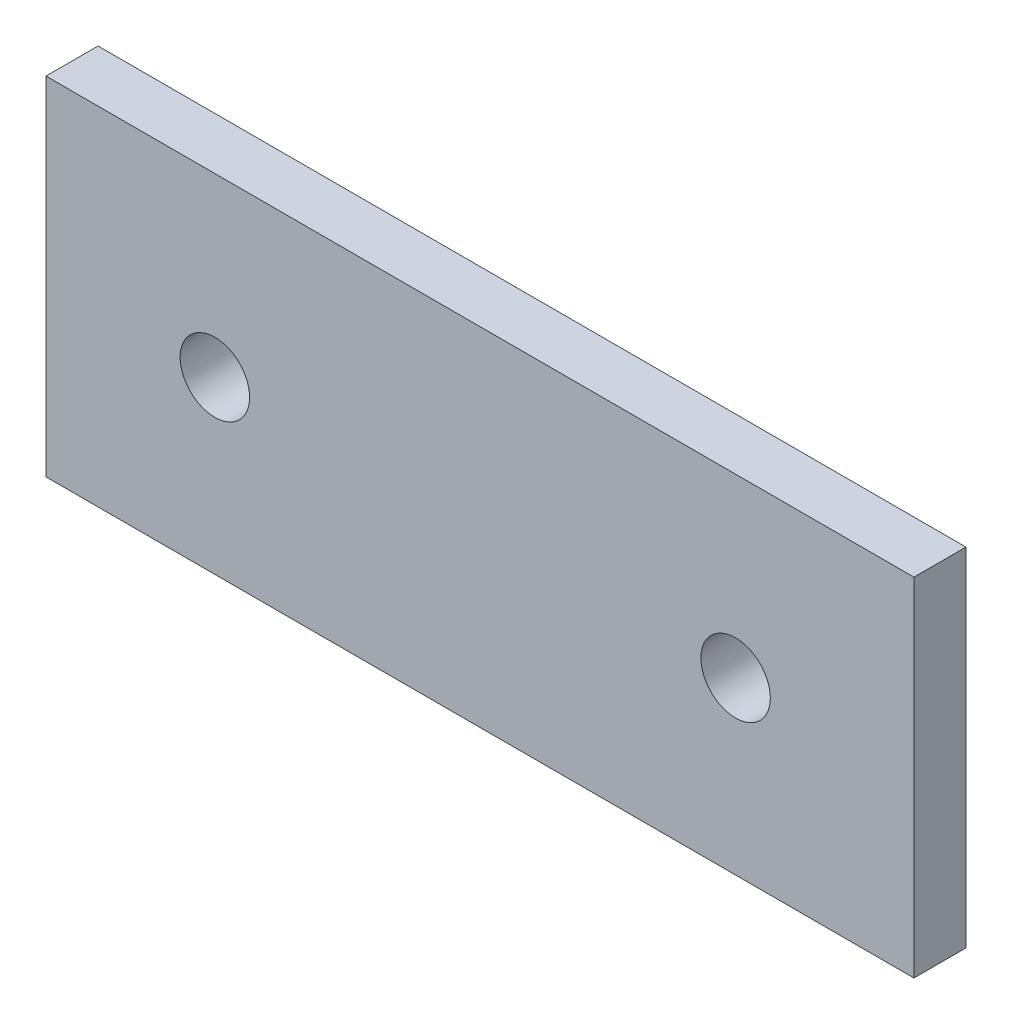
ISO-10303-21;
HEADER;
FILE_DESCRIPTION(('STEP AP214'),'2;1');
FILE_NAME('part.step','',(''),(''),'','','');
FILE_SCHEMA(('AUTOMOTIVE_DESIGN { 1 0 10303 214 1 1 1 1 }'));
ENDSEC;
DATA;
#1=APPLICATION_CONTEXT('core data for automotive mechanical design processes');
#2=APPLICATION_PROTOCOL_DEFINITION('international standard','automotive_design',2000,#1);
#3=PRODUCT_CONTEXT('',#1,'mechanical');
#4=PRODUCT('Part','Part','',(#3));
#5=PRODUCT_RELATED_PRODUCT_CATEGORY('part','',(#4));
#6=PRODUCT_DEFINITION_FORMATION('','',#4);
#7=PRODUCT_DEFINITION_CONTEXT('part definition',#1,'design');
#8=PRODUCT_DEFINITION('design','',#6,#7);
#9=PRODUCT_DEFINITION_SHAPE('','',#8);
#10=(LENGTH_UNIT() NAMED_UNIT(*) SI_UNIT(.MILLI.,.METRE.));
#11=(NAMED_UNIT(*) PLANE_ANGLE_UNIT() SI_UNIT($,.RADIAN.));
#12=(NAMED_UNIT(*) SI_UNIT($,.STERADIAN.) SOLID_ANGLE_UNIT());
#13=UNCERTAINTY_MEASURE_WITH_UNIT(LENGTH_MEASURE(1.E-05),#10,'distance_accuracy_value','');
#14=(GEOMETRIC_REPRESENTATION_CONTEXT(3) GLOBAL_UNCERTAINTY_ASSIGNED_CONTEXT((#13)) GLOBAL_UNIT_ASSIGNED_CONTEXT((#10,
#11,#12)) REPRESENTATION_CONTEXT('',''));
#15=CARTESIAN_POINT('',(0.,0.,0.));
#16=DIRECTION('',(0.,0.,1.));
#17=DIRECTION('',(1.,0.,0.));
#18=AXIS2_PLACEMENT_3D('',#15,#16,#17);
#19=CARTESIAN_POINT('',(0.,0.,3.));
#20=DIRECTION('',(0.,0.,1.));
#21=DIRECTION('',(1.,0.,0.));
#22=AXIS2_PLACEMENT_3D('',#19,#20,#21);
#23=PLANE('',#22);
#24=CARTESIAN_POINT('',(-67.7615716692326,0.,3.));
#25=DIRECTION('',(0.,0.,1.));
#26=DIRECTION('',(1.,0.,0.));
#27=AXIS2_PLACEMENT_3D('',#24,#25,#26);
#28=CIRCLE('',#27,2.);
#29=CARTESIAN_POINT('',(-65.7615716692326,0.,3.));
#30=VERTEX_POINT('',#29);
#31=EDGE_CURVE('E129',#30,#30,#28,.T.);
#32=ORIENTED_EDGE('',*,*,#31,.F.);
#33=EDGE_LOOP('',(#32));
#34=FACE_BOUND('',#33,.T.);
#35=DIRECTION('',(0.,-1.,0.));
#36=VECTOR('',#35,1.);
#37=CARTESIAN_POINT('',(-77.4890829508854,10.1651390959698,3.));
#38=LINE('',#37,#36);
#39=CARTESIAN_POINT('',(-77.4890829508854,10.1651390959698,3.));
#40=VERTEX_POINT('',#39);
#41=CARTESIAN_POINT('',(-77.4890829508854,-9.83486090403022,3.));
#42=VERTEX_POINT('',#41);
#43=EDGE_CURVE('E113',#40,#42,#38,.T.);
#44=ORIENTED_EDGE('',*,*,#43,.T.);
#45=DIRECTION('',(1.,0.,0.));
#46=VECTOR('',#45,1.);
#47=CARTESIAN_POINT('',(-77.4890829508854,-9.83486090403022,3.));
#48=LINE('',#47,#46);
#49=CARTESIAN_POINT('',(-27.4890829508854,-9.83486090403022,3.));
#50=VERTEX_POINT('',#49);
#51=EDGE_CURVE('E105',#42,#50,#48,.T.);
#52=ORIENTED_EDGE('',*,*,#51,.T.);
#53=DIRECTION('',(0.,-1.,0.));
#54=VECTOR('',#53,1.);
#55=CARTESIAN_POINT('',(-27.4890829508854,10.1651390959698,3.));
#56=LINE('',#55,#54);
#57=CARTESIAN_POINT('',(-27.4890829508854,10.1651390959698,3.));
#58=VERTEX_POINT('',#57);
#59=EDGE_CURVE('E112',#58,#50,#56,.T.);
#60=ORIENTED_EDGE('',*,*,#59,.F.);
#61=DIRECTION('',(1.,0.,0.));
#62=VECTOR('',#61,1.);
#63=CARTESIAN_POINT('',(-77.4890829508854,10.1651390959698,3.));
#64=LINE('',#63,#62);
#65=EDGE_CURVE('E122',#40,#58,#64,.T.);
#66=ORIENTED_EDGE('',*,*,#65,.F.);
#67=EDGE_LOOP('',(#44,#52,#60,#66));
#68=FACE_BOUND('',#67,.T.);
#69=CARTESIAN_POINT('',(-37.7615716692326,0.,3.));
#70=DIRECTION('',(0.,0.,1.));
#71=DIRECTION('',(1.,0.,0.));
#72=AXIS2_PLACEMENT_3D('',#69,#70,#71);
#73=CIRCLE('',#72,2.);
#74=CARTESIAN_POINT('',(-35.7615716692326,0.,3.));
#75=VERTEX_POINT('',#74);
#76=EDGE_CURVE('E142',#75,#75,#73,.T.);
#77=ORIENTED_EDGE('',*,*,#76,.F.);
#78=EDGE_LOOP('',(#77));
#79=FACE_BOUND('',#78,.T.);
#80=ADVANCED_FACE('F63',(#34,#68,#79),#23,.T.);
#81=CARTESIAN_POINT('',(0.,0.,0.));
#82=DIRECTION('',(0.,0.,1.));
#83=DIRECTION('',(1.,0.,0.));
#84=AXIS2_PLACEMENT_3D('',#81,#82,#83);
#85=PLANE('',#84);
#86=CARTESIAN_POINT('',(-67.7615716692326,0.,0.));
#87=DIRECTION('',(0.,0.,1.));
#88=DIRECTION('',(1.,0.,0.));
#89=AXIS2_PLACEMENT_3D('',#86,#87,#88);
#90=CIRCLE('',#89,2.);
#91=CARTESIAN_POINT('',(-65.7615716692326,0.,0.));
#92=VERTEX_POINT('',#91);
#93=EDGE_CURVE('E139',#92,#92,#90,.T.);
#94=ORIENTED_EDGE('',*,*,#93,.T.);
#95=EDGE_LOOP('',(#94));
#96=FACE_BOUND('',#95,.T.);
#97=DIRECTION('',(0.,-1.,0.));
#98=VECTOR('',#97,1.);
#99=CARTESIAN_POINT('',(-77.4890829508854,10.1651390959698,0.));
#100=LINE('',#99,#98);
#101=CARTESIAN_POINT('',(-77.4890829508854,10.1651390959698,0.));
#102=VERTEX_POINT('',#101);
#103=CARTESIAN_POINT('',(-77.4890829508854,-9.83486090403022,0.));
#104=VERTEX_POINT('',#103);
#105=EDGE_CURVE('E127',#102,#104,#100,.T.);
#106=ORIENTED_EDGE('',*,*,#105,.F.);
#107=DIRECTION('',(1.,0.,0.));
#108=VECTOR('',#107,1.);
#109=CARTESIAN_POINT('',(-77.4890829508854,10.1651390959698,0.));
#110=LINE('',#109,#108);
#111=CARTESIAN_POINT('',(-27.4890829508854,10.1651390959698,0.));
#112=VERTEX_POINT('',#111);
#113=EDGE_CURVE('E133',#102,#112,#110,.T.);
#114=ORIENTED_EDGE('',*,*,#113,.T.);
#115=DIRECTION('',(0.,-1.,0.));
#116=VECTOR('',#115,1.);
#117=CARTESIAN_POINT('',(-27.4890829508854,10.1651390959698,0.));
#118=LINE('',#117,#116);
#119=CARTESIAN_POINT('',(-27.4890829508854,-9.83486090403022,0.));
#120=VERTEX_POINT('',#119);
#121=EDGE_CURVE('E131',#112,#120,#118,.T.);
#122=ORIENTED_EDGE('',*,*,#121,.T.);
#123=DIRECTION('',(1.,0.,0.));
#124=VECTOR('',#123,1.);
#125=CARTESIAN_POINT('',(-77.4890829508854,-9.83486090403022,0.));
#126=LINE('',#125,#124);
#127=EDGE_CURVE('E118',#104,#120,#126,.T.);
#128=ORIENTED_EDGE('',*,*,#127,.F.);
#129=EDGE_LOOP('',(#106,#114,#122,#128));
#130=FACE_BOUND('',#129,.T.);
#131=CARTESIAN_POINT('',(-37.7615716692326,0.,0.));
#132=DIRECTION('',(0.,0.,1.));
#133=DIRECTION('',(1.,0.,0.));
#134=AXIS2_PLACEMENT_3D('',#131,#132,#133);
#135=CIRCLE('',#134,2.);
#136=CARTESIAN_POINT('',(-35.7615716692326,0.,0.));
#137=VERTEX_POINT('',#136);
#138=EDGE_CURVE('E145',#137,#137,#135,.T.);
#139=ORIENTED_EDGE('',*,*,#138,.T.);
#140=EDGE_LOOP('',(#139));
#141=FACE_BOUND('',#140,.T.);
#142=ADVANCED_FACE('F154',(#96,#130,#141),#85,.F.);
#143=CARTESIAN_POINT('',(-77.4890829508854,10.1651390959698,3.));
#144=DIRECTION('',(1.,0.,0.));
#145=DIRECTION('',(0.,0.,-1.));
#146=AXIS2_PLACEMENT_3D('',#143,#144,#145);
#147=PLANE('',#146);
#148=ORIENTED_EDGE('',*,*,#105,.T.);
#149=DIRECTION('',(0.,0.,-1.));
#150=VECTOR('',#149,1.);
#151=CARTESIAN_POINT('',(-77.4890829508854,-9.83486090403022,3.));
#152=LINE('',#151,#150);
#153=EDGE_CURVE('E12',#42,#104,#152,.T.);
#154=ORIENTED_EDGE('',*,*,#153,.F.);
#155=ORIENTED_EDGE('',*,*,#43,.F.);
#156=DIRECTION('',(0.,0.,-1.));
#157=VECTOR('',#156,1.);
#158=CARTESIAN_POINT('',(-77.4890829508854,10.1651390959698,3.));
#159=LINE('',#158,#157);
#160=EDGE_CURVE('E80',#40,#102,#159,.T.);
#161=ORIENTED_EDGE('',*,*,#160,.T.);
#162=EDGE_LOOP('',(#148,#154,#155,#161));
#163=FACE_BOUND('',#162,.T.);
#164=ADVANCED_FACE('F65',(#163),#147,.F.);
#165=CARTESIAN_POINT('',(-77.4890829508854,-9.83486090403022,3.));
#166=DIRECTION('',(0.,1.,0.));
#167=DIRECTION('',(0.,0.,1.));
#168=AXIS2_PLACEMENT_3D('',#165,#166,#167);
#169=PLANE('',#168);
#170=ORIENTED_EDGE('',*,*,#127,.T.);
#171=DIRECTION('',(0.,0.,-1.));
#172=VECTOR('',#171,1.);
#173=CARTESIAN_POINT('',(-27.4890829508854,-9.83486090403022,3.));
#174=LINE('',#173,#172);
#175=EDGE_CURVE('E72',#50,#120,#174,.T.);
#176=ORIENTED_EDGE('',*,*,#175,.F.);
#177=ORIENTED_EDGE('',*,*,#51,.F.);
#178=ORIENTED_EDGE('',*,*,#153,.T.);
#179=EDGE_LOOP('',(#170,#176,#177,#178));
#180=FACE_BOUND('',#179,.T.);
#181=ADVANCED_FACE('F117',(#180),#169,.F.);
#182=CARTESIAN_POINT('',(-27.4890829508854,10.1651390959698,3.));
#183=DIRECTION('',(1.,0.,0.));
#184=DIRECTION('',(0.,0.,-1.));
#185=AXIS2_PLACEMENT_3D('',#182,#183,#184);
#186=PLANE('',#185);
#187=ORIENTED_EDGE('',*,*,#121,.F.);
#188=DIRECTION('',(0.,0.,-1.));
#189=VECTOR('',#188,1.);
#190=CARTESIAN_POINT('',(-27.4890829508854,10.1651390959698,3.));
#191=LINE('',#190,#189);
#192=EDGE_CURVE('E94',#58,#112,#191,.T.);
#193=ORIENTED_EDGE('',*,*,#192,.F.);
#194=ORIENTED_EDGE('',*,*,#59,.T.);
#195=ORIENTED_EDGE('',*,*,#175,.T.);
#196=EDGE_LOOP('',(#187,#193,#194,#195));
#197=FACE_BOUND('',#196,.T.);
#198=ADVANCED_FACE('F121',(#197),#186,.T.);
#199=CARTESIAN_POINT('',(-77.4890829508854,10.1651390959698,3.));
#200=DIRECTION('',(0.,1.,0.));
#201=DIRECTION('',(0.,0.,1.));
#202=AXIS2_PLACEMENT_3D('',#199,#200,#201);
#203=PLANE('',#202);
#204=ORIENTED_EDGE('',*,*,#113,.F.);
#205=ORIENTED_EDGE('',*,*,#160,.F.);
#206=ORIENTED_EDGE('',*,*,#65,.T.);
#207=ORIENTED_EDGE('',*,*,#192,.T.);
#208=EDGE_LOOP('',(#204,#205,#206,#207));
#209=FACE_BOUND('',#208,.T.);
#210=ADVANCED_FACE('F167',(#209),#203,.T.);
#211=CARTESIAN_POINT('',(-67.7615716692326,0.,3.));
#212=DIRECTION('',(0.,0.,-1.));
#213=DIRECTION('',(-1.,0.,0.));
#214=AXIS2_PLACEMENT_3D('',#211,#212,#213);
#215=CYLINDRICAL_SURFACE('',#214,2.);
#216=ORIENTED_EDGE('',*,*,#31,.T.);
#217=EDGE_LOOP('',(#216));
#218=FACE_BOUND('',#217,.T.);
#219=ORIENTED_EDGE('',*,*,#93,.F.);
#220=EDGE_LOOP('',(#219));
#221=FACE_BOUND('',#220,.T.);
#222=ADVANCED_FACE('F164',(#218,#221),#215,.F.);
#223=CARTESIAN_POINT('',(-37.7615716692326,0.,3.));
#224=DIRECTION('',(0.,0.,-1.));
#225=DIRECTION('',(-1.,0.,0.));
#226=AXIS2_PLACEMENT_3D('',#223,#224,#225);
#227=CYLINDRICAL_SURFACE('',#226,2.);
#228=ORIENTED_EDGE('',*,*,#76,.T.);
#229=EDGE_LOOP('',(#228));
#230=FACE_BOUND('',#229,.T.);
#231=ORIENTED_EDGE('',*,*,#138,.F.);
#232=EDGE_LOOP('',(#231));
#233=FACE_BOUND('',#232,.T.);
#234=ADVANCED_FACE('F151',(#230,#233),#227,.F.);
#235=CLOSED_SHELL('',(#80,#142,#164,#181,#198,#210,#222,#234));
#236=MANIFOLD_SOLID_BREP('B2',#235);
#237=ADVANCED_BREP_SHAPE_REPRESENTATION('',(#18,#236),#14);
#238=SHAPE_DEFINITION_REPRESENTATION(#9,#237);
ENDSEC;
END-ISO-10303-21;
